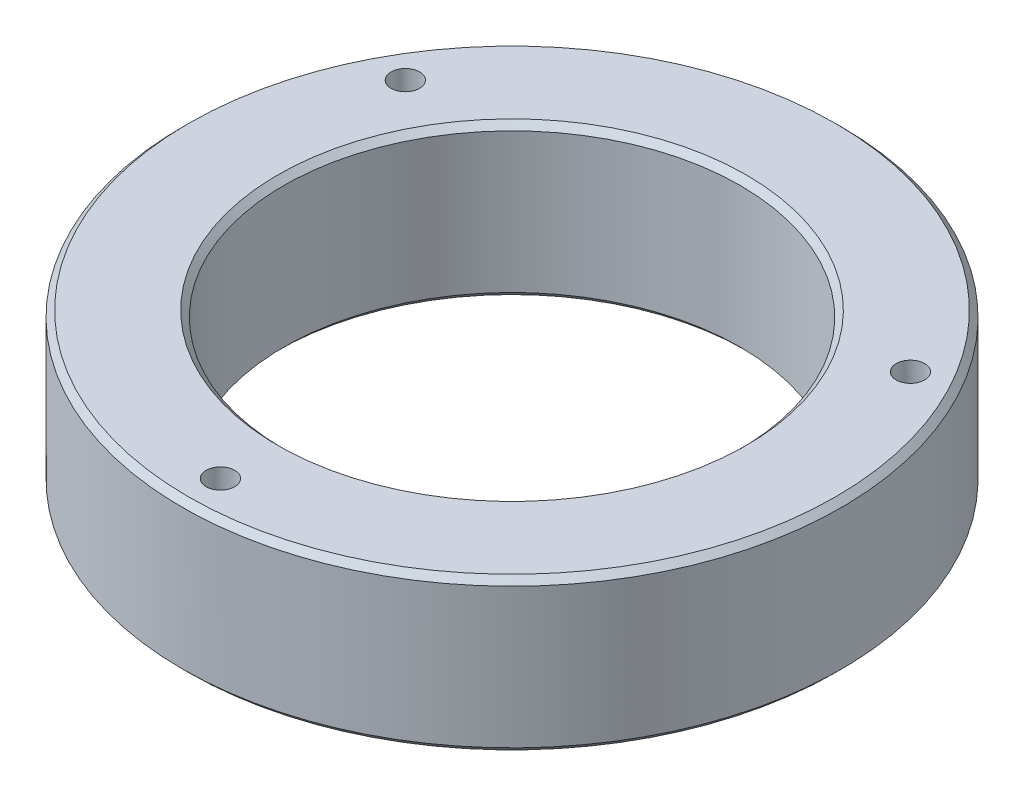
ISO-10303-21;
HEADER;
FILE_DESCRIPTION(('STEP AP214'),'2;1');
FILE_NAME('part.step','',(''),(''),'','','');
FILE_SCHEMA(('AUTOMOTIVE_DESIGN { 1 0 10303 214 1 1 1 1 }'));
ENDSEC;
DATA;
#1=APPLICATION_CONTEXT('core data for automotive mechanical design processes');
#2=APPLICATION_PROTOCOL_DEFINITION('international standard','automotive_design',2000,#1);
#3=PRODUCT_CONTEXT('',#1,'mechanical');
#4=PRODUCT('Part','Part','',(#3));
#5=PRODUCT_RELATED_PRODUCT_CATEGORY('part','',(#4));
#6=PRODUCT_DEFINITION_FORMATION('','',#4);
#7=PRODUCT_DEFINITION_CONTEXT('part definition',#1,'design');
#8=PRODUCT_DEFINITION('design','',#6,#7);
#9=PRODUCT_DEFINITION_SHAPE('','',#8);
#10=(LENGTH_UNIT() NAMED_UNIT(*) SI_UNIT(.MILLI.,.METRE.));
#11=(NAMED_UNIT(*) PLANE_ANGLE_UNIT() SI_UNIT($,.RADIAN.));
#12=(NAMED_UNIT(*) SI_UNIT($,.STERADIAN.) SOLID_ANGLE_UNIT());
#13=UNCERTAINTY_MEASURE_WITH_UNIT(LENGTH_MEASURE(1.E-05),#10,'distance_accuracy_value','');
#14=(GEOMETRIC_REPRESENTATION_CONTEXT(3) GLOBAL_UNCERTAINTY_ASSIGNED_CONTEXT((#13)) GLOBAL_UNIT_ASSIGNED_CONTEXT((#10,
#11,#12)) REPRESENTATION_CONTEXT('',''));
#15=CARTESIAN_POINT('',(0.,0.,0.));
#16=DIRECTION('',(0.,0.,1.));
#17=DIRECTION('',(1.,0.,0.));
#18=AXIS2_PLACEMENT_3D('',#15,#16,#17);
#19=CARTESIAN_POINT('',(-57.15,-19.05,0.));
#20=DIRECTION('',(0.,1.,0.));
#21=DIRECTION('',(0.,0.,1.));
#22=AXIS2_PLACEMENT_3D('',#19,#20,#21);
#23=PLANE('',#22);
#24=CARTESIAN_POINT('',(69.85,-19.05,0.));
#25=DIRECTION('',(0.,1.,0.));
#26=DIRECTION('',(0.,0.,1.));
#27=AXIS2_PLACEMENT_3D('',#24,#25,#26);
#28=CIRCLE('',#27,3.96874999999999);
#29=CARTESIAN_POINT('',(69.85,-19.05,3.96874999999999));
#30=VERTEX_POINT('',#29);
#31=EDGE_CURVE('E296',#30,#30,#28,.T.);
#32=ORIENTED_EDGE('',*,*,#31,.T.);
#33=EDGE_LOOP('',(#32));
#34=FACE_BOUND('',#33,.T.);
#35=CARTESIAN_POINT('',(-69.85,-19.05,0.));
#36=DIRECTION('',(0.,1.,0.));
#37=DIRECTION('',(0.,0.,1.));
#38=AXIS2_PLACEMENT_3D('',#35,#36,#37);
#39=CIRCLE('',#38,3.96874999999999);
#40=CARTESIAN_POINT('',(-69.85,-19.05,3.96874999999999));
#41=VERTEX_POINT('',#40);
#42=EDGE_CURVE('E300',#41,#41,#39,.T.);
#43=ORIENTED_EDGE('',*,*,#42,.T.);
#44=EDGE_LOOP('',(#43));
#45=FACE_BOUND('',#44,.T.);
#46=CARTESIAN_POINT('',(0.,-19.05,73.025));
#47=DIRECTION('',(0.,1.,0.));
#48=DIRECTION('',(0.,0.,1.));
#49=AXIS2_PLACEMENT_3D('',#46,#47,#48);
#50=CIRCLE('',#49,5.5626);
#51=CARTESIAN_POINT('',(0.,-19.05,78.5876));
#52=VERTEX_POINT('',#51);
#53=EDGE_CURVE('E310',#52,#52,#50,.T.);
#54=ORIENTED_EDGE('',*,*,#53,.T.);
#55=EDGE_LOOP('',(#54));
#56=FACE_BOUND('',#55,.T.);
#57=CARTESIAN_POINT('',(63.246,-19.05,-36.5252));
#58=DIRECTION('',(0.,1.,0.));
#59=DIRECTION('',(0.,0.,1.));
#60=AXIS2_PLACEMENT_3D('',#57,#58,#59);
#61=CIRCLE('',#60,5.5626);
#62=CARTESIAN_POINT('',(63.246,-19.05,-30.9626));
#63=VERTEX_POINT('',#62);
#64=EDGE_CURVE('E313',#63,#63,#61,.T.);
#65=ORIENTED_EDGE('',*,*,#64,.T.);
#66=EDGE_LOOP('',(#65));
#67=FACE_BOUND('',#66,.T.);
#68=CARTESIAN_POINT('',(-63.246,-19.05,-36.5252));
#69=DIRECTION('',(0.,1.,0.));
#70=DIRECTION('',(0.,0.,1.));
#71=AXIS2_PLACEMENT_3D('',#68,#69,#70);
#72=CIRCLE('',#71,5.5626);
#73=CARTESIAN_POINT('',(-63.246,-19.05,-30.9626));
#74=VERTEX_POINT('',#73);
#75=EDGE_CURVE('E299',#74,#74,#72,.T.);
#76=ORIENTED_EDGE('',*,*,#75,.T.);
#77=EDGE_LOOP('',(#76));
#78=FACE_BOUND('',#77,.T.);
#79=CARTESIAN_POINT('',(0.,-19.05,0.));
#80=DIRECTION('',(0.,1.,0.));
#81=DIRECTION('',(0.,0.,1.));
#82=AXIS2_PLACEMENT_3D('',#79,#80,#81);
#83=CIRCLE('',#82,58.674);
#84=CARTESIAN_POINT('',(0.,-19.05,-58.674));
#85=VERTEX_POINT('',#84);
#86=EDGE_CURVE('E57',#85,#85,#83,.T.);
#87=ORIENTED_EDGE('',*,*,#86,.T.);
#88=EDGE_LOOP('',(#87));
#89=FACE_BOUND('',#88,.T.);
#90=CARTESIAN_POINT('',(0.,-19.05,0.));
#91=DIRECTION('',(0.,1.,0.));
#92=DIRECTION('',(0.,0.,1.));
#93=AXIS2_PLACEMENT_3D('',#90,#91,#92);
#94=CIRCLE('',#93,81.0006);
#95=CARTESIAN_POINT('',(0.,-19.05,81.0006));
#96=VERTEX_POINT('',#95);
#97=EDGE_CURVE('E117',#96,#96,#94,.F.);
#98=ORIENTED_EDGE('',*,*,#97,.T.);
#99=EDGE_LOOP('',(#98));
#100=FACE_BOUND('',#99,.T.);
#101=ADVANCED_FACE('F43',(#34,#45,#56,#67,#78,#89,#100),#23,.F.);
#102=CARTESIAN_POINT('',(0.,-44.45,0.));
#103=DIRECTION('',(0.,-1.,0.));
#104=DIRECTION('',(0.,0.,-1.));
#105=AXIS2_PLACEMENT_3D('',#102,#103,#104);
#106=CYLINDRICAL_SURFACE('',#105,82.5246);
#107=CARTESIAN_POINT('',(0.,17.526,0.));
#108=DIRECTION('',(0.,-1.,0.));
#109=DIRECTION('',(0.,0.,-1.));
#110=AXIS2_PLACEMENT_3D('',#107,#108,#109);
#111=CIRCLE('',#110,82.5246);
#112=CARTESIAN_POINT('',(0.,17.526,-82.5246));
#113=VERTEX_POINT('',#112);
#114=EDGE_CURVE('E10',#113,#113,#111,.T.);
#115=ORIENTED_EDGE('',*,*,#114,.T.);
#116=EDGE_LOOP('',(#115));
#117=FACE_BOUND('',#116,.T.);
#118=CARTESIAN_POINT('',(0.,-17.526,0.));
#119=DIRECTION('',(0.,1.,0.));
#120=DIRECTION('',(0.,0.,1.));
#121=AXIS2_PLACEMENT_3D('',#118,#119,#120);
#122=CIRCLE('',#121,82.5246);
#123=CARTESIAN_POINT('',(0.,-17.526,82.5246));
#124=VERTEX_POINT('',#123);
#125=EDGE_CURVE('E52',#124,#124,#122,.T.);
#126=ORIENTED_EDGE('',*,*,#125,.T.);
#127=EDGE_LOOP('',(#126));
#128=FACE_BOUND('',#127,.T.);
#129=ADVANCED_FACE('F95',(#117,#128),#106,.T.);
#130=CARTESIAN_POINT('',(-82.5246,19.05,0.));
#131=DIRECTION('',(0.,-1.,0.));
#132=DIRECTION('',(0.,0.,-1.));
#133=AXIS2_PLACEMENT_3D('',#130,#131,#132);
#134=PLANE('',#133);
#135=CARTESIAN_POINT('',(0.,19.05,73.025));
#136=DIRECTION('',(0.,-1.,0.));
#137=DIRECTION('',(0.,0.,-1.));
#138=AXIS2_PLACEMENT_3D('',#135,#136,#137);
#139=CIRCLE('',#138,3.5687);
#140=CARTESIAN_POINT('',(0.,19.05,69.4563));
#141=VERTEX_POINT('',#140);
#142=EDGE_CURVE('E67',#141,#141,#139,.F.);
#143=ORIENTED_EDGE('',*,*,#142,.F.);
#144=EDGE_LOOP('',(#143));
#145=FACE_BOUND('',#144,.T.);
#146=CARTESIAN_POINT('',(63.246,19.05,-36.5252));
#147=DIRECTION('',(0.,-1.,0.));
#148=DIRECTION('',(0.,0.,-1.));
#149=AXIS2_PLACEMENT_3D('',#146,#147,#148);
#150=CIRCLE('',#149,3.5687);
#151=CARTESIAN_POINT('',(63.246,19.05,-40.0939));
#152=VERTEX_POINT('',#151);
#153=EDGE_CURVE('E64',#152,#152,#150,.F.);
#154=ORIENTED_EDGE('',*,*,#153,.F.);
#155=EDGE_LOOP('',(#154));
#156=FACE_BOUND('',#155,.T.);
#157=CARTESIAN_POINT('',(-63.246,19.05,-36.5252));
#158=DIRECTION('',(0.,-1.,0.));
#159=DIRECTION('',(0.,0.,-1.));
#160=AXIS2_PLACEMENT_3D('',#157,#158,#159);
#161=CIRCLE('',#160,3.56869999999999);
#162=CARTESIAN_POINT('',(-63.246,19.05,-40.0939));
#163=VERTEX_POINT('',#162);
#164=EDGE_CURVE('E61',#163,#163,#161,.F.);
#165=ORIENTED_EDGE('',*,*,#164,.F.);
#166=EDGE_LOOP('',(#165));
#167=FACE_BOUND('',#166,.T.);
#168=CARTESIAN_POINT('',(0.,19.05,0.));
#169=DIRECTION('',(0.,-1.,0.));
#170=DIRECTION('',(0.,0.,-1.));
#171=AXIS2_PLACEMENT_3D('',#168,#169,#170);
#172=CIRCLE('',#171,58.674);
#173=CARTESIAN_POINT('',(0.,19.05,-58.674));
#174=VERTEX_POINT('',#173);
#175=EDGE_CURVE('E101',#174,#174,#172,.T.);
#176=ORIENTED_EDGE('',*,*,#175,.T.);
#177=EDGE_LOOP('',(#176));
#178=FACE_BOUND('',#177,.T.);
#179=CARTESIAN_POINT('',(0.,19.05,0.));
#180=DIRECTION('',(0.,-1.,0.));
#181=DIRECTION('',(0.,0.,-1.));
#182=AXIS2_PLACEMENT_3D('',#179,#180,#181);
#183=CIRCLE('',#182,81.0006);
#184=CARTESIAN_POINT('',(0.,19.05,-81.0006));
#185=VERTEX_POINT('',#184);
#186=EDGE_CURVE('E70',#185,#185,#183,.F.);
#187=ORIENTED_EDGE('',*,*,#186,.T.);
#188=EDGE_LOOP('',(#187));
#189=FACE_BOUND('',#188,.T.);
#190=ADVANCED_FACE('F91',(#145,#156,#167,#178,#189),#134,.F.);
#191=CARTESIAN_POINT('',(0.,-44.45,0.));
#192=DIRECTION('',(0.,-1.,0.));
#193=DIRECTION('',(0.,0.,-1.));
#194=AXIS2_PLACEMENT_3D('',#191,#192,#193);
#195=CYLINDRICAL_SURFACE('',#194,57.15);
#196=CARTESIAN_POINT('',(0.,17.526,0.));
#197=DIRECTION('',(0.,-1.,0.));
#198=DIRECTION('',(0.,0.,-1.));
#199=AXIS2_PLACEMENT_3D('',#196,#197,#198);
#200=CIRCLE('',#199,57.15);
#201=CARTESIAN_POINT('',(0.,17.526,-57.15));
#202=VERTEX_POINT('',#201);
#203=EDGE_CURVE('E114',#202,#202,#200,.F.);
#204=CARTESIAN_POINT('',(0.,-17.526,0.));
#205=DIRECTION('',(0.,1.,0.));
#206=DIRECTION('',(0.,0.,1.));
#207=AXIS2_PLACEMENT_3D('',#204,#205,#206);
#208=CIRCLE('',#207,57.15);
#209=CARTESIAN_POINT('',(0.,-17.526,-57.15));
#210=VERTEX_POINT('',#209);
#211=EDGE_CURVE('E106',#210,#210,#208,.F.);
#212=CARTESIAN_POINT('',(0.,17.526,-57.15));
#213=CARTESIAN_POINT('',(0.,17.160875,-57.15));
#214=CARTESIAN_POINT('',(0.,16.79575,-57.15));
#215=CARTESIAN_POINT('',(0.,16.0655,-57.15));
#216=CARTESIAN_POINT('',(0.,15.700375,-57.15));
#217=CARTESIAN_POINT('',(0.,14.970125,-57.15));
#218=CARTESIAN_POINT('',(0.,14.605,-57.15));
#219=CARTESIAN_POINT('',(0.,13.87475,-57.15));
#220=CARTESIAN_POINT('',(0.,13.509625,-57.15));
#221=CARTESIAN_POINT('',(0.,12.779375,-57.15));
#222=CARTESIAN_POINT('',(0.,12.41425,-57.15));
#223=CARTESIAN_POINT('',(0.,11.684,-57.15));
#224=CARTESIAN_POINT('',(0.,11.318875,-57.15));
#225=CARTESIAN_POINT('',(0.,10.588625,-57.15));
#226=CARTESIAN_POINT('',(0.,10.2235,-57.15));
#227=CARTESIAN_POINT('',(0.,9.49324999999998,-57.15));
#228=CARTESIAN_POINT('',(0.,9.12812499999998,-57.15));
#229=CARTESIAN_POINT('',(0.,8.39787499999998,-57.15));
#230=CARTESIAN_POINT('',(0.,8.03274999999998,-57.15));
#231=CARTESIAN_POINT('',(0.,7.30249999999998,-57.15));
#232=CARTESIAN_POINT('',(0.,6.93737499999998,-57.15));
#233=CARTESIAN_POINT('',(0.,6.20712499999998,-57.15));
#234=CARTESIAN_POINT('',(0.,5.84199999999998,-57.15));
#235=CARTESIAN_POINT('',(0.,5.11174999999998,-57.15));
#236=CARTESIAN_POINT('',(0.,4.74662499999998,-57.15));
#237=CARTESIAN_POINT('',(0.,4.01637499999998,-57.15));
#238=CARTESIAN_POINT('',(0.,3.65124999999998,-57.15));
#239=CARTESIAN_POINT('',(0.,2.92099999999998,-57.15));
#240=CARTESIAN_POINT('',(0.,2.55587499999998,-57.15));
#241=CARTESIAN_POINT('',(0.,1.82562499999998,-57.15));
#242=CARTESIAN_POINT('',(0.,1.46049999999998,-57.15));
#243=CARTESIAN_POINT('',(0.,0.730249999999976,-57.15));
#244=CARTESIAN_POINT('',(0.,0.365124999999978,-57.15));
#245=CARTESIAN_POINT('',(0.,-0.365125000000019,-57.15));
#246=CARTESIAN_POINT('',(0.,-0.730250000000018,-57.15));
#247=CARTESIAN_POINT('',(0.,-1.46050000000002,-57.15));
#248=CARTESIAN_POINT('',(0.,-1.82562500000002,-57.15));
#249=CARTESIAN_POINT('',(0.,-2.55587500000002,-57.15));
#250=CARTESIAN_POINT('',(0.,-2.92100000000002,-57.15));
#251=CARTESIAN_POINT('',(0.,-3.65125000000002,-57.15));
#252=CARTESIAN_POINT('',(0.,-4.01637500000002,-57.15));
#253=CARTESIAN_POINT('',(0.,-4.74662500000002,-57.15));
#254=CARTESIAN_POINT('',(0.,-5.11175000000002,-57.15));
#255=CARTESIAN_POINT('',(0.,-5.84200000000002,-57.15));
#256=CARTESIAN_POINT('',(0.,-6.20712500000002,-57.15));
#257=CARTESIAN_POINT('',(0.,-6.93737500000002,-57.15));
#258=CARTESIAN_POINT('',(0.,-7.30250000000002,-57.15));
#259=CARTESIAN_POINT('',(0.,-8.03275000000002,-57.15));
#260=CARTESIAN_POINT('',(0.,-8.39787500000002,-57.15));
#261=CARTESIAN_POINT('',(0.,-9.12812500000002,-57.15));
#262=CARTESIAN_POINT('',(0.,-9.49325000000002,-57.15));
#263=CARTESIAN_POINT('',(0.,-10.2235,-57.15));
#264=CARTESIAN_POINT('',(0.,-10.588625,-57.15));
#265=CARTESIAN_POINT('',(0.,-11.318875,-57.15));
#266=CARTESIAN_POINT('',(0.,-11.684,-57.15));
#267=CARTESIAN_POINT('',(0.,-12.41425,-57.15));
#268=CARTESIAN_POINT('',(0.,-12.779375,-57.15));
#269=CARTESIAN_POINT('',(0.,-13.509625,-57.15));
#270=CARTESIAN_POINT('',(0.,-13.87475,-57.15));
#271=CARTESIAN_POINT('',(0.,-14.605,-57.15));
#272=CARTESIAN_POINT('',(0.,-14.970125,-57.15));
#273=CARTESIAN_POINT('',(0.,-15.700375,-57.15));
#274=CARTESIAN_POINT('',(0.,-16.0655,-57.15));
#275=CARTESIAN_POINT('',(0.,-16.79575,-57.15));
#276=CARTESIAN_POINT('',(0.,-17.160875,-57.15));
#277=CARTESIAN_POINT('',(0.,-17.526,-57.15));
#278=B_SPLINE_CURVE_WITH_KNOTS('',3,(#212,#213,#214,#215,#216,#217,#218,#219,#220,#221,#222,
#223,#224,#225,#226,#227,#228,#229,#230,#231,#232,#233,#234,#235,#236,#237,#238,#239,#240,#241,
#242,#243,#244,#245,#246,#247,#248,#249,#250,#251,#252,#253,#254,#255,#256,#257,#258,#259,#260,
#261,#262,#263,#264,#265,#266,#267,#268,#269,#270,#271,#272,#273,#274,#275,#276,#277),
.UNSPECIFIED.,.F.,.F.,(4,2,2,2,2,2,2,2,2,2,2,2,2,2,2,2,2,2,2,2,2,2,2,2,2,2,2,2,2,2,2,2,4),(0.,
1.095375,2.19075,3.286125,4.3815,5.476875,6.57225,7.667625,8.763,9.858375,10.95375,12.049125,
13.1445,14.239875,15.33525,16.430625,17.526,18.621375,19.71675,20.812125,21.9075,23.002875,
24.09825,25.193625,26.289,27.384375,28.47975,29.575125,30.6705,31.765875,32.86125,33.956625,
35.052),.UNSPECIFIED.);
#279=EDGE_CURVE('BSEAM94',#202,#210,#278,.T.);
#280=ORIENTED_EDGE('',*,*,#203,.T.);
#281=ORIENTED_EDGE('',*,*,#211,.T.);
#282=ORIENTED_EDGE('',*,*,#279,.T.);
#283=ORIENTED_EDGE('',*,*,#279,.F.);
#284=EDGE_LOOP('',(#280,#282,#281,#283));
#285=FACE_BOUND('',#284,.T.);
#286=ADVANCED_FACE('F94',(#285),#195,.F.);
#287=CARTESIAN_POINT('',(0.,19.05,0.));
#288=DIRECTION('',(0.,1.,0.));
#289=DIRECTION('',(0.,0.,1.));
#290=AXIS2_PLACEMENT_3D('',#287,#288,#289);
#291=CONICAL_SURFACE('',#290,58.674,0.785398163397435);
#292=ORIENTED_EDGE('',*,*,#203,.F.);
#293=EDGE_LOOP('',(#292));
#294=FACE_BOUND('',#293,.T.);
#295=ORIENTED_EDGE('',*,*,#175,.F.);
#296=EDGE_LOOP('',(#295));
#297=FACE_BOUND('',#296,.T.);
#298=ADVANCED_FACE('F128',(#294,#297),#291,.F.);
#299=CARTESIAN_POINT('',(0.,-17.526,0.));
#300=DIRECTION('',(0.,-1.,0.));
#301=DIRECTION('',(0.,0.,-1.));
#302=AXIS2_PLACEMENT_3D('',#299,#300,#301);
#303=CONICAL_SURFACE('',#302,57.15,0.785398163397451);
#304=CARTESIAN_POINT('',(0.,-19.05,-58.674));
#305=CARTESIAN_POINT('',(0.,-19.034125,-58.658125));
#306=CARTESIAN_POINT('',(0.,-19.01825,-58.64225));
#307=CARTESIAN_POINT('',(0.,-18.9865,-58.6105));
#308=CARTESIAN_POINT('',(0.,-18.970625,-58.594625));
#309=CARTESIAN_POINT('',(0.,-18.938875,-58.562875));
#310=CARTESIAN_POINT('',(0.,-18.923,-58.547));
#311=CARTESIAN_POINT('',(0.,-18.89125,-58.51525));
#312=CARTESIAN_POINT('',(0.,-18.875375,-58.499375));
#313=CARTESIAN_POINT('',(0.,-18.843625,-58.467625));
#314=CARTESIAN_POINT('',(0.,-18.82775,-58.45175));
#315=CARTESIAN_POINT('',(0.,-18.796,-58.42));
#316=CARTESIAN_POINT('',(0.,-18.780125,-58.404125));
#317=CARTESIAN_POINT('',(0.,-18.748375,-58.372375));
#318=CARTESIAN_POINT('',(0.,-18.7325,-58.3565));
#319=CARTESIAN_POINT('',(0.,-18.70075,-58.32475));
#320=CARTESIAN_POINT('',(0.,-18.684875,-58.308875));
#321=CARTESIAN_POINT('',(0.,-18.653125,-58.277125));
#322=CARTESIAN_POINT('',(0.,-18.63725,-58.26125));
#323=CARTESIAN_POINT('',(0.,-18.6055,-58.2295));
#324=CARTESIAN_POINT('',(0.,-18.589625,-58.213625));
#325=CARTESIAN_POINT('',(0.,-18.557875,-58.181875));
#326=CARTESIAN_POINT('',(0.,-18.542,-58.166));
#327=CARTESIAN_POINT('',(0.,-18.51025,-58.13425));
#328=CARTESIAN_POINT('',(0.,-18.494375,-58.118375));
#329=CARTESIAN_POINT('',(0.,-18.462625,-58.086625));
#330=CARTESIAN_POINT('',(0.,-18.44675,-58.07075));
#331=CARTESIAN_POINT('',(0.,-18.415,-58.039));
#332=CARTESIAN_POINT('',(0.,-18.399125,-58.023125));
#333=CARTESIAN_POINT('',(0.,-18.367375,-57.991375));
#334=CARTESIAN_POINT('',(0.,-18.3515,-57.9755));
#335=CARTESIAN_POINT('',(0.,-18.31975,-57.94375));
#336=CARTESIAN_POINT('',(0.,-18.303875,-57.927875));
#337=CARTESIAN_POINT('',(0.,-18.272125,-57.896125));
#338=CARTESIAN_POINT('',(0.,-18.25625,-57.88025));
#339=CARTESIAN_POINT('',(0.,-18.2245,-57.8485));
#340=CARTESIAN_POINT('',(0.,-18.208625,-57.832625));
#341=CARTESIAN_POINT('',(0.,-18.176875,-57.800875));
#342=CARTESIAN_POINT('',(0.,-18.161,-57.785));
#343=CARTESIAN_POINT('',(0.,-18.12925,-57.75325));
#344=CARTESIAN_POINT('',(0.,-18.113375,-57.737375));
#345=CARTESIAN_POINT('',(0.,-18.081625,-57.705625));
#346=CARTESIAN_POINT('',(0.,-18.06575,-57.68975));
#347=CARTESIAN_POINT('',(0.,-18.034,-57.658));
#348=CARTESIAN_POINT('',(0.,-18.018125,-57.642125));
#349=CARTESIAN_POINT('',(0.,-17.986375,-57.610375));
#350=CARTESIAN_POINT('',(0.,-17.9705,-57.5945));
#351=CARTESIAN_POINT('',(0.,-17.93875,-57.56275));
#352=CARTESIAN_POINT('',(0.,-17.922875,-57.546875));
#353=CARTESIAN_POINT('',(0.,-17.891125,-57.515125));
#354=CARTESIAN_POINT('',(0.,-17.87525,-57.49925));
#355=CARTESIAN_POINT('',(0.,-17.8435,-57.4675));
#356=CARTESIAN_POINT('',(0.,-17.827625,-57.451625));
#357=CARTESIAN_POINT('',(0.,-17.795875,-57.419875));
#358=CARTESIAN_POINT('',(0.,-17.78,-57.404));
#359=CARTESIAN_POINT('',(0.,-17.74825,-57.37225));
#360=CARTESIAN_POINT('',(0.,-17.732375,-57.356375));
#361=CARTESIAN_POINT('',(0.,-17.700625,-57.324625));
#362=CARTESIAN_POINT('',(0.,-17.68475,-57.30875));
#363=CARTESIAN_POINT('',(0.,-17.653,-57.277));
#364=CARTESIAN_POINT('',(0.,-17.637125,-57.261125));
#365=CARTESIAN_POINT('',(0.,-17.605375,-57.229375));
#366=CARTESIAN_POINT('',(0.,-17.5895,-57.2135));
#367=CARTESIAN_POINT('',(0.,-17.55775,-57.18175));
#368=CARTESIAN_POINT('',(0.,-17.541875,-57.165875));
#369=CARTESIAN_POINT('',(0.,-17.526,-57.15));
#370=B_SPLINE_CURVE_WITH_KNOTS('',3,(#304,#305,#306,#307,#308,#309,#310,#311,#312,#313,#314,
#315,#316,#317,#318,#319,#320,#321,#322,#323,#324,#325,#326,#327,#328,#329,#330,#331,#332,#333,
#334,#335,#336,#337,#338,#339,#340,#341,#342,#343,#344,#345,#346,#347,#348,#349,#350,#351,#352,
#353,#354,#355,#356,#357,#358,#359,#360,#361,#362,#363,#364,#365,#366,#367,#368,#369),
.UNSPECIFIED.,.F.,.F.,(4,2,2,2,2,2,2,2,2,2,2,2,2,2,2,2,2,2,2,2,2,2,2,2,2,2,2,2,2,2,2,2,4),(0.,
0.0673519209080149,0.134703841816037,0.202055762724052,0.269407683632072,0.336759604540087,
0.404111525448106,0.471463446356126,0.538815367264141,0.606167288172161,0.673519209080176,
0.740871129988195,0.80822305089621,0.87557497180423,0.94292689271225,1.01027881362026,
1.07763073452828,1.1449826554363,1.21233457634432,1.27968649725234,1.34703841816036,
1.41439033906838,1.48174225997639,1.54909418088441,1.61644610179242,1.68379802270044,
1.75114994360846,1.81850186451648,1.88585378542449,1.95320570633251,2.02055762724053,
2.08790954814855,2.15526146905657),.UNSPECIFIED.);
#371=EDGE_CURVE('BSEAM124',#85,#210,#370,.T.);
#372=ORIENTED_EDGE('',*,*,#86,.F.);
#373=ORIENTED_EDGE('',*,*,#211,.F.);
#374=ORIENTED_EDGE('',*,*,#371,.T.);
#375=ORIENTED_EDGE('',*,*,#371,.F.);
#376=EDGE_LOOP('',(#372,#374,#373,#375));
#377=FACE_BOUND('',#376,.T.);
#378=ADVANCED_FACE('F124',(#377),#303,.F.);
#379=CARTESIAN_POINT('',(0.,17.526,0.));
#380=DIRECTION('',(0.,-1.,0.));
#381=DIRECTION('',(0.,0.,-1.));
#382=AXIS2_PLACEMENT_3D('',#379,#380,#381);
#383=CONICAL_SURFACE('',#382,82.5246,0.785398163397451);
#384=ORIENTED_EDGE('',*,*,#186,.F.);
#385=EDGE_LOOP('',(#384));
#386=FACE_BOUND('',#385,.T.);
#387=ORIENTED_EDGE('',*,*,#114,.F.);
#388=EDGE_LOOP('',(#387));
#389=FACE_BOUND('',#388,.T.);
#390=ADVANCED_FACE('F127',(#386,#389),#383,.T.);
#391=CARTESIAN_POINT('',(0.,-19.05,0.));
#392=DIRECTION('',(0.,1.,0.));
#393=DIRECTION('',(0.,0.,1.));
#394=AXIS2_PLACEMENT_3D('',#391,#392,#393);
#395=CONICAL_SURFACE('',#394,81.0006,0.785398163397448);
#396=ORIENTED_EDGE('',*,*,#125,.F.);
#397=EDGE_LOOP('',(#396));
#398=FACE_BOUND('',#397,.T.);
#399=ORIENTED_EDGE('',*,*,#97,.F.);
#400=EDGE_LOOP('',(#399));
#401=FACE_BOUND('',#400,.T.);
#402=ADVANCED_FACE('F46',(#398,#401),#395,.T.);
#403=CARTESIAN_POINT('',(-63.246,57.15,-36.5252));
#404=DIRECTION('',(0.,-1.,0.));
#405=DIRECTION('',(0.,0.,-1.));
#406=AXIS2_PLACEMENT_3D('',#403,#404,#405);
#407=CYLINDRICAL_SURFACE('',#406,3.56869999999999);
#408=CARTESIAN_POINT('',(-63.246,-9.398,-36.5252));
#409=DIRECTION('',(0.,1.,0.));
#410=DIRECTION('',(0.,0.,1.));
#411=AXIS2_PLACEMENT_3D('',#408,#409,#410);
#412=CIRCLE('',#411,3.56869999999999);
#413=CARTESIAN_POINT('',(-63.246,-9.398,-32.9565));
#414=VERTEX_POINT('',#413);
#415=EDGE_CURVE('E48',#414,#414,#412,.T.);
#416=ORIENTED_EDGE('',*,*,#415,.F.);
#417=EDGE_LOOP('',(#416));
#418=FACE_BOUND('',#417,.T.);
#419=ORIENTED_EDGE('',*,*,#164,.T.);
#420=EDGE_LOOP('',(#419));
#421=FACE_BOUND('',#420,.T.);
#422=ADVANCED_FACE('F84',(#418,#421),#407,.F.);
#423=CARTESIAN_POINT('',(63.246,57.15,-36.5252));
#424=DIRECTION('',(0.,-1.,0.));
#425=DIRECTION('',(0.,0.,-1.));
#426=AXIS2_PLACEMENT_3D('',#423,#424,#425);
#427=CYLINDRICAL_SURFACE('',#426,3.5687);
#428=CARTESIAN_POINT('',(63.246,-9.398,-36.5252));
#429=DIRECTION('',(0.,1.,0.));
#430=DIRECTION('',(0.,0.,1.));
#431=AXIS2_PLACEMENT_3D('',#428,#429,#430);
#432=CIRCLE('',#431,3.5687);
#433=CARTESIAN_POINT('',(63.246,-9.398,-32.9565));
#434=VERTEX_POINT('',#433);
#435=EDGE_CURVE('E73',#434,#434,#432,.T.);
#436=ORIENTED_EDGE('',*,*,#435,.F.);
#437=EDGE_LOOP('',(#436));
#438=FACE_BOUND('',#437,.T.);
#439=ORIENTED_EDGE('',*,*,#153,.T.);
#440=EDGE_LOOP('',(#439));
#441=FACE_BOUND('',#440,.T.);
#442=ADVANCED_FACE('F87',(#438,#441),#427,.F.);
#443=CARTESIAN_POINT('',(0.,57.15,73.025));
#444=DIRECTION('',(0.,-1.,0.));
#445=DIRECTION('',(0.,0.,-1.));
#446=AXIS2_PLACEMENT_3D('',#443,#444,#445);
#447=CYLINDRICAL_SURFACE('',#446,3.5687);
#448=CARTESIAN_POINT('',(0.,-9.398,73.025));
#449=DIRECTION('',(0.,1.,0.));
#450=DIRECTION('',(0.,0.,1.));
#451=AXIS2_PLACEMENT_3D('',#448,#449,#450);
#452=CIRCLE('',#451,3.5687);
#453=CARTESIAN_POINT('',(0.,-9.398,76.5937));
#454=VERTEX_POINT('',#453);
#455=EDGE_CURVE('E71',#454,#454,#452,.T.);
#456=ORIENTED_EDGE('',*,*,#455,.F.);
#457=EDGE_LOOP('',(#456));
#458=FACE_BOUND('',#457,.T.);
#459=ORIENTED_EDGE('',*,*,#142,.T.);
#460=EDGE_LOOP('',(#459));
#461=FACE_BOUND('',#460,.T.);
#462=ADVANCED_FACE('F190',(#458,#461),#447,.F.);
#463=CARTESIAN_POINT('',(0.,-9.398,73.025));
#464=DIRECTION('',(0.,-1.,0.));
#465=DIRECTION('',(0.,0.,-1.));
#466=AXIS2_PLACEMENT_3D('',#463,#464,#465);
#467=CYLINDRICAL_SURFACE('',#466,5.5626);
#468=CARTESIAN_POINT('',(0.,-9.398,73.025));
#469=DIRECTION('',(0.,1.,0.));
#470=DIRECTION('',(0.,0.,1.));
#471=AXIS2_PLACEMENT_3D('',#468,#469,#470);
#472=CIRCLE('',#471,5.5626);
#473=CARTESIAN_POINT('',(0.,-9.398,78.5876));
#474=VERTEX_POINT('',#473);
#475=EDGE_CURVE('E74',#474,#474,#472,.T.);
#476=ORIENTED_EDGE('',*,*,#475,.T.);
#477=EDGE_LOOP('',(#476));
#478=FACE_BOUND('',#477,.T.);
#479=ORIENTED_EDGE('',*,*,#53,.F.);
#480=EDGE_LOOP('',(#479));
#481=FACE_BOUND('',#480,.T.);
#482=ADVANCED_FACE('F199',(#478,#481),#467,.F.);
#483=CARTESIAN_POINT('',(0.,-9.398,73.025));
#484=DIRECTION('',(0.,1.,0.));
#485=DIRECTION('',(0.,0.,1.));
#486=AXIS2_PLACEMENT_3D('',#483,#484,#485);
#487=PLANE('',#486);
#488=ORIENTED_EDGE('',*,*,#455,.T.);
#489=EDGE_LOOP('',(#488));
#490=FACE_BOUND('',#489,.T.);
#491=ORIENTED_EDGE('',*,*,#475,.F.);
#492=EDGE_LOOP('',(#491));
#493=FACE_BOUND('',#492,.T.);
#494=ADVANCED_FACE('F208',(#490,#493),#487,.F.);
#495=CARTESIAN_POINT('',(63.246,-9.398,-36.5252));
#496=DIRECTION('',(0.,-1.,0.));
#497=DIRECTION('',(0.,0.,-1.));
#498=AXIS2_PLACEMENT_3D('',#495,#496,#497);
#499=CYLINDRICAL_SURFACE('',#498,5.5626);
#500=CARTESIAN_POINT('',(63.246,-9.398,-36.5252));
#501=DIRECTION('',(0.,1.,0.));
#502=DIRECTION('',(0.,0.,1.));
#503=AXIS2_PLACEMENT_3D('',#500,#501,#502);
#504=CIRCLE('',#503,5.5626);
#505=CARTESIAN_POINT('',(63.246,-9.398,-30.9626));
#506=VERTEX_POINT('',#505);
#507=EDGE_CURVE('E316',#506,#506,#504,.T.);
#508=ORIENTED_EDGE('',*,*,#507,.T.);
#509=EDGE_LOOP('',(#508));
#510=FACE_BOUND('',#509,.T.);
#511=ORIENTED_EDGE('',*,*,#64,.F.);
#512=EDGE_LOOP('',(#511));
#513=FACE_BOUND('',#512,.T.);
#514=ADVANCED_FACE('F217',(#510,#513),#499,.F.);
#515=CARTESIAN_POINT('',(63.246,-9.398,-36.5252));
#516=DIRECTION('',(0.,1.,0.));
#517=DIRECTION('',(0.,0.,1.));
#518=AXIS2_PLACEMENT_3D('',#515,#516,#517);
#519=PLANE('',#518);
#520=ORIENTED_EDGE('',*,*,#435,.T.);
#521=EDGE_LOOP('',(#520));
#522=FACE_BOUND('',#521,.T.);
#523=ORIENTED_EDGE('',*,*,#507,.F.);
#524=EDGE_LOOP('',(#523));
#525=FACE_BOUND('',#524,.T.);
#526=ADVANCED_FACE('F226',(#522,#525),#519,.F.);
#527=CARTESIAN_POINT('',(-63.246,-9.398,-36.5252));
#528=DIRECTION('',(0.,-1.,0.));
#529=DIRECTION('',(0.,0.,-1.));
#530=AXIS2_PLACEMENT_3D('',#527,#528,#529);
#531=CYLINDRICAL_SURFACE('',#530,5.5626);
#532=CARTESIAN_POINT('',(-63.246,-9.398,-36.5252));
#533=DIRECTION('',(0.,1.,0.));
#534=DIRECTION('',(0.,0.,1.));
#535=AXIS2_PLACEMENT_3D('',#532,#533,#534);
#536=CIRCLE('',#535,5.5626);
#537=CARTESIAN_POINT('',(-63.246,-9.398,-30.9626));
#538=VERTEX_POINT('',#537);
#539=EDGE_CURVE('E109',#538,#538,#536,.T.);
#540=ORIENTED_EDGE('',*,*,#539,.T.);
#541=EDGE_LOOP('',(#540));
#542=FACE_BOUND('',#541,.T.);
#543=ORIENTED_EDGE('',*,*,#75,.F.);
#544=EDGE_LOOP('',(#543));
#545=FACE_BOUND('',#544,.T.);
#546=ADVANCED_FACE('F235',(#542,#545),#531,.F.);
#547=CARTESIAN_POINT('',(-63.246,-9.398,-36.5252));
#548=DIRECTION('',(0.,1.,0.));
#549=DIRECTION('',(0.,0.,1.));
#550=AXIS2_PLACEMENT_3D('',#547,#548,#549);
#551=PLANE('',#550);
#552=ORIENTED_EDGE('',*,*,#415,.T.);
#553=EDGE_LOOP('',(#552));
#554=FACE_BOUND('',#553,.T.);
#555=ORIENTED_EDGE('',*,*,#539,.F.);
#556=EDGE_LOOP('',(#555));
#557=FACE_BOUND('',#556,.T.);
#558=ADVANCED_FACE('F81',(#554,#557),#551,.F.);
#559=CARTESIAN_POINT('',(-69.85,6.35,0.));
#560=DIRECTION('',(0.,-1.,0.));
#561=DIRECTION('',(0.,0.,-1.));
#562=AXIS2_PLACEMENT_3D('',#559,#560,#561);
#563=CYLINDRICAL_SURFACE('',#562,3.96874999999999);
#564=CARTESIAN_POINT('',(-69.85,6.35,0.));
#565=DIRECTION('',(0.,1.,0.));
#566=DIRECTION('',(0.,0.,1.));
#567=AXIS2_PLACEMENT_3D('',#564,#565,#566);
#568=CIRCLE('',#567,3.96874999999999);
#569=CARTESIAN_POINT('',(-69.85,6.35,3.96874999999999));
#570=VERTEX_POINT('',#569);
#571=EDGE_CURVE('E305',#570,#570,#568,.T.);
#572=ORIENTED_EDGE('',*,*,#571,.T.);
#573=EDGE_LOOP('',(#572));
#574=FACE_BOUND('',#573,.T.);
#575=ORIENTED_EDGE('',*,*,#42,.F.);
#576=EDGE_LOOP('',(#575));
#577=FACE_BOUND('',#576,.T.);
#578=ADVANCED_FACE('F249',(#574,#577),#563,.F.);
#579=CARTESIAN_POINT('',(-69.85,6.35,0.));
#580=DIRECTION('',(0.,1.,0.));
#581=DIRECTION('',(0.,0.,1.));
#582=AXIS2_PLACEMENT_3D('',#579,#580,#581);
#583=PLANE('',#582);
#584=ORIENTED_EDGE('',*,*,#571,.F.);
#585=EDGE_LOOP('',(#584));
#586=FACE_BOUND('',#585,.T.);
#587=ADVANCED_FACE('F260',(#586),#583,.F.);
#588=CARTESIAN_POINT('',(69.85,6.35,0.));
#589=DIRECTION('',(0.,-1.,0.));
#590=DIRECTION('',(0.,0.,-1.));
#591=AXIS2_PLACEMENT_3D('',#588,#589,#590);
#592=CYLINDRICAL_SURFACE('',#591,3.96874999999999);
#593=CARTESIAN_POINT('',(69.85,6.35,0.));
#594=DIRECTION('',(0.,1.,0.));
#595=DIRECTION('',(0.,0.,1.));
#596=AXIS2_PLACEMENT_3D('',#593,#594,#595);
#597=CIRCLE('',#596,3.96874999999999);
#598=CARTESIAN_POINT('',(69.85,6.35,3.96874999999999));
#599=VERTEX_POINT('',#598);
#600=EDGE_CURVE('E295',#599,#599,#597,.T.);
#601=ORIENTED_EDGE('',*,*,#600,.T.);
#602=EDGE_LOOP('',(#601));
#603=FACE_BOUND('',#602,.T.);
#604=ORIENTED_EDGE('',*,*,#31,.F.);
#605=EDGE_LOOP('',(#604));
#606=FACE_BOUND('',#605,.T.);
#607=ADVANCED_FACE('F270',(#603,#606),#592,.F.);
#608=CARTESIAN_POINT('',(69.85,6.35,0.));
#609=DIRECTION('',(0.,1.,0.));
#610=DIRECTION('',(0.,0.,1.));
#611=AXIS2_PLACEMENT_3D('',#608,#609,#610);
#612=PLANE('',#611);
#613=ORIENTED_EDGE('',*,*,#600,.F.);
#614=EDGE_LOOP('',(#613));
#615=FACE_BOUND('',#614,.T.);
#616=ADVANCED_FACE('F280',(#615),#612,.F.);
#617=CLOSED_SHELL('',(#101,#129,#190,#286,#298,#378,#390,#402,#422,#442,#462,#482,#494,#514,
#526,#546,#558,#578,#587,#607,#616));
#618=MANIFOLD_SOLID_BREP('B2',#617);
#619=ADVANCED_BREP_SHAPE_REPRESENTATION('',(#18,#618),#14);
#620=SHAPE_DEFINITION_REPRESENTATION(#9,#619);
ENDSEC;
END-ISO-10303-21;
